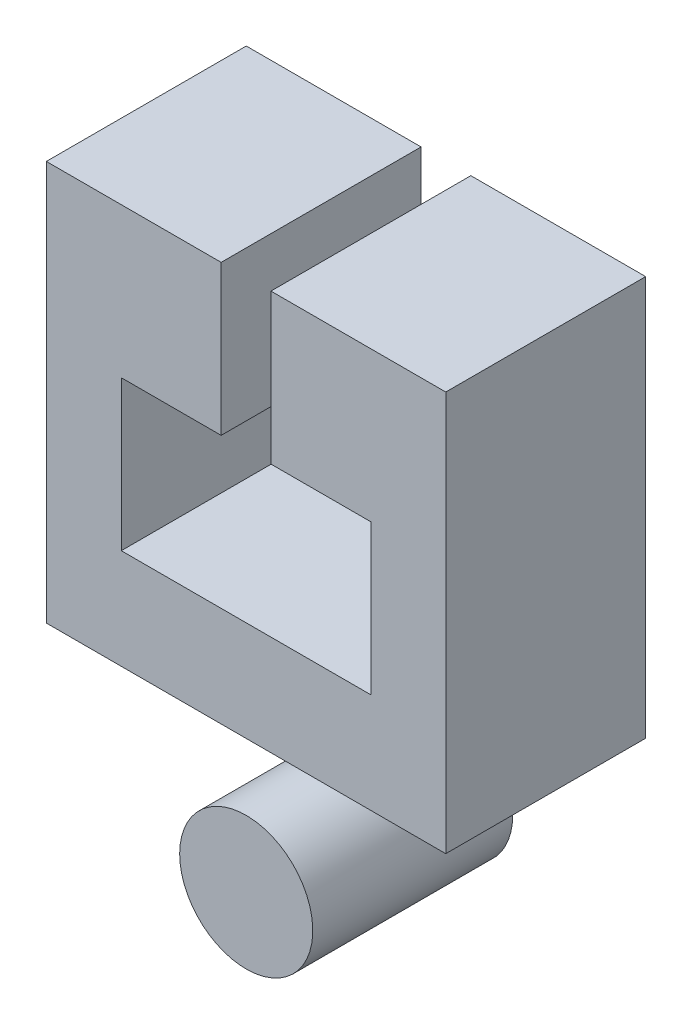
ISO-10303-21;
HEADER;
FILE_DESCRIPTION(('STEP AP214'),'2;1');
FILE_NAME('part.step','',(''),(''),'','','');
FILE_SCHEMA(('AUTOMOTIVE_DESIGN { 1 0 10303 214 1 1 1 1 }'));
ENDSEC;
DATA;
#1=APPLICATION_CONTEXT('core data for automotive mechanical design processes');
#2=APPLICATION_PROTOCOL_DEFINITION('international standard','automotive_design',2000,#1);
#3=PRODUCT_CONTEXT('',#1,'mechanical');
#4=PRODUCT('Part','Part','',(#3));
#5=PRODUCT_RELATED_PRODUCT_CATEGORY('part','',(#4));
#6=PRODUCT_DEFINITION_FORMATION('','',#4);
#7=PRODUCT_DEFINITION_CONTEXT('part definition',#1,'design');
#8=PRODUCT_DEFINITION('design','',#6,#7);
#9=PRODUCT_DEFINITION_SHAPE('','',#8);
#10=(LENGTH_UNIT() NAMED_UNIT(*) SI_UNIT(.MILLI.,.METRE.));
#11=(NAMED_UNIT(*) PLANE_ANGLE_UNIT() SI_UNIT($,.RADIAN.));
#12=(NAMED_UNIT(*) SI_UNIT($,.STERADIAN.) SOLID_ANGLE_UNIT());
#13=UNCERTAINTY_MEASURE_WITH_UNIT(LENGTH_MEASURE(1.E-05),#10,'distance_accuracy_value','');
#14=(GEOMETRIC_REPRESENTATION_CONTEXT(3) GLOBAL_UNCERTAINTY_ASSIGNED_CONTEXT((#13)) GLOBAL_UNIT_ASSIGNED_CONTEXT((#10,
#11,#12)) REPRESENTATION_CONTEXT('',''));
#15=CARTESIAN_POINT('',(0.,0.,0.));
#16=DIRECTION('',(0.,0.,1.));
#17=DIRECTION('',(1.,0.,0.));
#18=AXIS2_PLACEMENT_3D('',#15,#16,#17);
#19=CARTESIAN_POINT('',(0.,101.6,-50.8));
#20=DIRECTION('',(0.,-1.,0.));
#21=DIRECTION('',(0.,0.,-1.));
#22=AXIS2_PLACEMENT_3D('',#19,#20,#21);
#23=PLANE('',#22);
#24=DIRECTION('',(0.,0.,1.));
#25=VECTOR('',#24,1.);
#26=CARTESIAN_POINT('',(-6.32460000000001,101.6,-50.8));
#27=LINE('',#26,#25);
#28=CARTESIAN_POINT('',(-6.32460000000001,101.6,-50.8));
#29=VERTEX_POINT('',#28);
#30=CARTESIAN_POINT('',(-6.32460000000001,101.6,0.));
#31=VERTEX_POINT('',#30);
#32=EDGE_CURVE('E206',#29,#31,#27,.T.);
#33=ORIENTED_EDGE('',*,*,#32,.F.);
#34=DIRECTION('',(1.,0.,0.));
#35=VECTOR('',#34,1.);
#36=CARTESIAN_POINT('',(0.,101.6,-50.8));
#37=LINE('',#36,#35);
#38=CARTESIAN_POINT('',(-50.7492,101.6,-50.8));
#39=VERTEX_POINT('',#38);
#40=EDGE_CURVE('E242',#39,#29,#37,.T.);
#41=ORIENTED_EDGE('',*,*,#40,.F.);
#42=DIRECTION('',(0.,0.,1.));
#43=VECTOR('',#42,1.);
#44=CARTESIAN_POINT('',(-50.7492,101.6,-50.8));
#45=LINE('',#44,#43);
#46=CARTESIAN_POINT('',(-50.7492,101.6,0.));
#47=VERTEX_POINT('',#46);
#48=EDGE_CURVE('E256',#39,#47,#45,.T.);
#49=ORIENTED_EDGE('',*,*,#48,.T.);
#50=DIRECTION('',(1.,0.,0.));
#51=VECTOR('',#50,1.);
#52=CARTESIAN_POINT('',(0.,101.6,0.));
#53=LINE('',#52,#51);
#54=EDGE_CURVE('E260',#47,#31,#53,.T.);
#55=ORIENTED_EDGE('',*,*,#54,.T.);
#56=EDGE_LOOP('',(#33,#41,#49,#55));
#57=FACE_BOUND('',#56,.T.);
#58=ADVANCED_FACE('F41',(#57),#23,.F.);
#59=CARTESIAN_POINT('',(0.,0.,-50.8));
#60=DIRECTION('',(0.,0.,1.));
#61=DIRECTION('',(1.,0.,0.));
#62=AXIS2_PLACEMENT_3D('',#59,#60,#61);
#63=PLANE('',#62);
#64=DIRECTION('',(0.,-1.,0.));
#65=VECTOR('',#64,1.);
#66=CARTESIAN_POINT('',(16.9598350312076,0.,-50.8));
#67=LINE('',#66,#65);
#68=CARTESIAN_POINT('',(16.9598350312076,0.,-50.8));
#69=VERTEX_POINT('',#68);
#70=CARTESIAN_POINT('',(16.9598350312076,-33.8328,-50.8));
#71=VERTEX_POINT('',#70);
#72=EDGE_CURVE('E57',#69,#71,#67,.T.);
#73=ORIENTED_EDGE('',*,*,#72,.T.);
#74=CARTESIAN_POINT('',(0.0434350312076039,-33.8328,-50.8));
#75=DIRECTION('',(0.,0.,-1.));
#76=DIRECTION('',(-1.,0.,0.));
#77=AXIS2_PLACEMENT_3D('',#74,#75,#76);
#78=CIRCLE('',#77,16.9164);
#79=CARTESIAN_POINT('',(-16.8729649687924,-33.8328,-50.8));
#80=VERTEX_POINT('',#79);
#81=EDGE_CURVE('E158',#71,#80,#78,.T.);
#82=ORIENTED_EDGE('',*,*,#81,.T.);
#83=DIRECTION('',(0.,1.,0.));
#84=VECTOR('',#83,1.);
#85=CARTESIAN_POINT('',(-16.8729649687924,0.,-50.8));
#86=LINE('',#85,#84);
#87=CARTESIAN_POINT('',(-16.8729649687924,0.,-50.8));
#88=VERTEX_POINT('',#87);
#89=EDGE_CURVE('E167',#80,#88,#86,.T.);
#90=ORIENTED_EDGE('',*,*,#89,.T.);
#91=DIRECTION('',(1.,0.,0.));
#92=VECTOR('',#91,1.);
#93=CARTESIAN_POINT('',(0.,0.,-50.8));
#94=LINE('',#93,#92);
#95=CARTESIAN_POINT('',(-50.7492,0.,-50.8));
#96=VERTEX_POINT('',#95);
#97=EDGE_CURVE('E252',#96,#88,#94,.T.);
#98=ORIENTED_EDGE('',*,*,#97,.F.);
#99=DIRECTION('',(0.,1.,0.));
#100=VECTOR('',#99,1.);
#101=CARTESIAN_POINT('',(-50.7492,0.,-50.8));
#102=LINE('',#101,#100);
#103=EDGE_CURVE('E250',#96,#39,#102,.T.);
#104=ORIENTED_EDGE('',*,*,#103,.T.);
#105=ORIENTED_EDGE('',*,*,#40,.T.);
#106=DIRECTION('',(0.,-1.,0.));
#107=VECTOR('',#106,1.);
#108=CARTESIAN_POINT('',(-6.32460000000001,101.6,-50.8));
#109=LINE('',#108,#107);
#110=CARTESIAN_POINT('',(-6.3246,63.5254,-50.8));
#111=VERTEX_POINT('',#110);
#112=EDGE_CURVE('E201',#29,#111,#109,.T.);
#113=ORIENTED_EDGE('',*,*,#112,.T.);
#114=DIRECTION('',(-1.,0.,0.));
#115=VECTOR('',#114,1.);
#116=CARTESIAN_POINT('',(-6.3246,63.5254,-50.8));
#117=LINE('',#116,#115);
#118=CARTESIAN_POINT('',(-31.70428,63.5254,-50.8));
#119=VERTEX_POINT('',#118);
#120=EDGE_CURVE('E205',#111,#119,#117,.T.);
#121=ORIENTED_EDGE('',*,*,#120,.T.);
#122=DIRECTION('',(0.,-1.,0.));
#123=VECTOR('',#122,1.);
#124=CARTESIAN_POINT('',(-31.70428,63.5254,-50.8));
#125=LINE('',#124,#123);
#126=CARTESIAN_POINT('',(-31.70428,25.4508,-50.8));
#127=VERTEX_POINT('',#126);
#128=EDGE_CURVE('E200',#119,#127,#125,.T.);
#129=ORIENTED_EDGE('',*,*,#128,.T.);
#130=DIRECTION('',(-1.,0.,0.));
#131=VECTOR('',#130,1.);
#132=CARTESIAN_POINT('',(31.70428,25.4508,-50.8));
#133=LINE('',#132,#131);
#134=CARTESIAN_POINT('',(31.70428,25.4508,-50.8));
#135=VERTEX_POINT('',#134);
#136=EDGE_CURVE('E199',#135,#127,#133,.T.);
#137=ORIENTED_EDGE('',*,*,#136,.F.);
#138=DIRECTION('',(0.,-1.,0.));
#139=VECTOR('',#138,1.);
#140=CARTESIAN_POINT('',(31.70428,63.5254,-50.8));
#141=LINE('',#140,#139);
#142=CARTESIAN_POINT('',(31.70428,63.5254,-50.8));
#143=VERTEX_POINT('',#142);
#144=EDGE_CURVE('E194',#143,#135,#141,.T.);
#145=ORIENTED_EDGE('',*,*,#144,.F.);
#146=DIRECTION('',(1.,0.,0.));
#147=VECTOR('',#146,1.);
#148=CARTESIAN_POINT('',(6.3246,63.5254,-50.8));
#149=LINE('',#148,#147);
#150=CARTESIAN_POINT('',(6.3246,63.5254,-50.8));
#151=VERTEX_POINT('',#150);
#152=EDGE_CURVE('E192',#151,#143,#149,.T.);
#153=ORIENTED_EDGE('',*,*,#152,.F.);
#154=DIRECTION('',(0.,-1.,0.));
#155=VECTOR('',#154,1.);
#156=CARTESIAN_POINT('',(6.3246,101.6,-50.8));
#157=LINE('',#156,#155);
#158=CARTESIAN_POINT('',(6.3246,101.6,-50.8));
#159=VERTEX_POINT('',#158);
#160=EDGE_CURVE('E191',#159,#151,#157,.T.);
#161=ORIENTED_EDGE('',*,*,#160,.F.);
#162=CARTESIAN_POINT('',(50.7492,101.6,-50.8));
#163=VERTEX_POINT('',#162);
#164=EDGE_CURVE('E247',#159,#163,#37,.T.);
#165=ORIENTED_EDGE('',*,*,#164,.T.);
#166=DIRECTION('',(0.,1.,0.));
#167=VECTOR('',#166,1.);
#168=CARTESIAN_POINT('',(50.7492,0.,-50.8));
#169=LINE('',#168,#167);
#170=CARTESIAN_POINT('',(50.7492,0.,-50.8));
#171=VERTEX_POINT('',#170);
#172=EDGE_CURVE('E254',#171,#163,#169,.T.);
#173=ORIENTED_EDGE('',*,*,#172,.F.);
#174=EDGE_CURVE('E249',#69,#171,#94,.T.);
#175=ORIENTED_EDGE('',*,*,#174,.F.);
#176=EDGE_LOOP('',(#73,#82,#90,#98,#104,#105,#113,#121,#129,#137,#145,#153,#161,#165,#173,#175));
#177=FACE_BOUND('',#176,.T.);
#178=ADVANCED_FACE('F166',(#177),#63,.F.);
#179=ORIENTED_EDGE('',*,*,#164,.F.);
#180=DIRECTION('',(0.,0.,1.));
#181=VECTOR('',#180,1.);
#182=CARTESIAN_POINT('',(6.3246,101.6,-50.8));
#183=LINE('',#182,#181);
#184=CARTESIAN_POINT('',(6.3246,101.6,0.));
#185=VERTEX_POINT('',#184);
#186=EDGE_CURVE('E239',#159,#185,#183,.T.);
#187=ORIENTED_EDGE('',*,*,#186,.T.);
#188=CARTESIAN_POINT('',(50.7492,101.6,0.));
#189=VERTEX_POINT('',#188);
#190=EDGE_CURVE('E243',#185,#189,#53,.T.);
#191=ORIENTED_EDGE('',*,*,#190,.T.);
#192=DIRECTION('',(0.,0.,1.));
#193=VECTOR('',#192,1.);
#194=CARTESIAN_POINT('',(50.7492,101.6,-50.8));
#195=LINE('',#194,#193);
#196=EDGE_CURVE('E47',#163,#189,#195,.T.);
#197=ORIENTED_EDGE('',*,*,#196,.F.);
#198=EDGE_LOOP('',(#179,#187,#191,#197));
#199=FACE_BOUND('',#198,.T.);
#200=ADVANCED_FACE('F43',(#199),#23,.F.);
#201=CARTESIAN_POINT('',(50.7492,0.,-50.8));
#202=DIRECTION('',(1.,0.,0.));
#203=DIRECTION('',(0.,0.,-1.));
#204=AXIS2_PLACEMENT_3D('',#201,#202,#203);
#205=PLANE('',#204);
#206=DIRECTION('',(0.,1.,0.));
#207=VECTOR('',#206,1.);
#208=CARTESIAN_POINT('',(50.7492,0.,0.));
#209=LINE('',#208,#207);
#210=CARTESIAN_POINT('',(50.7492,0.,0.));
#211=VERTEX_POINT('',#210);
#212=EDGE_CURVE('E261',#211,#189,#209,.T.);
#213=ORIENTED_EDGE('',*,*,#212,.F.);
#214=DIRECTION('',(0.,0.,1.));
#215=VECTOR('',#214,1.);
#216=CARTESIAN_POINT('',(50.7492,0.,-50.8));
#217=LINE('',#216,#215);
#218=EDGE_CURVE('E266',#171,#211,#217,.T.);
#219=ORIENTED_EDGE('',*,*,#218,.F.);
#220=ORIENTED_EDGE('',*,*,#172,.T.);
#221=ORIENTED_EDGE('',*,*,#196,.T.);
#222=EDGE_LOOP('',(#213,#219,#220,#221));
#223=FACE_BOUND('',#222,.T.);
#224=ADVANCED_FACE('F299',(#223),#205,.T.);
#225=CARTESIAN_POINT('',(0.,0.,-50.8));
#226=DIRECTION('',(0.,-1.,0.));
#227=DIRECTION('',(0.,0.,-1.));
#228=AXIS2_PLACEMENT_3D('',#225,#226,#227);
#229=PLANE('',#228);
#230=DIRECTION('',(0.,0.,-1.));
#231=VECTOR('',#230,1.);
#232=CARTESIAN_POINT('',(-16.8729649687924,0.,-50.2412));
#233=LINE('',#232,#231);
#234=CARTESIAN_POINT('',(-16.8729649687924,0.,-50.2412));
#235=VERTEX_POINT('',#234);
#236=EDGE_CURVE('E180',#235,#88,#233,.T.);
#237=ORIENTED_EDGE('',*,*,#236,.F.);
#238=DIRECTION('',(1.,0.,0.));
#239=VECTOR('',#238,1.);
#240=CARTESIAN_POINT('',(-16.8729649687924,0.,-50.2412));
#241=LINE('',#240,#239);
#242=CARTESIAN_POINT('',(16.9598350312076,0.,-50.2412));
#243=VERTEX_POINT('',#242);
#244=EDGE_CURVE('E328',#235,#243,#241,.T.);
#245=ORIENTED_EDGE('',*,*,#244,.T.);
#246=DIRECTION('',(0.,0.,-1.));
#247=VECTOR('',#246,1.);
#248=CARTESIAN_POINT('',(16.9598350312076,0.,-50.2412));
#249=LINE('',#248,#247);
#250=EDGE_CURVE('E189',#243,#69,#249,.T.);
#251=ORIENTED_EDGE('',*,*,#250,.T.);
#252=ORIENTED_EDGE('',*,*,#174,.T.);
#253=ORIENTED_EDGE('',*,*,#218,.T.);
#254=DIRECTION('',(1.,0.,0.));
#255=VECTOR('',#254,1.);
#256=CARTESIAN_POINT('',(0.,0.,0.));
#257=LINE('',#256,#255);
#258=CARTESIAN_POINT('',(-50.7492,0.,0.));
#259=VERTEX_POINT('',#258);
#260=EDGE_CURVE('E264',#259,#211,#257,.T.);
#261=ORIENTED_EDGE('',*,*,#260,.F.);
#262=DIRECTION('',(0.,0.,1.));
#263=VECTOR('',#262,1.);
#264=CARTESIAN_POINT('',(-50.7492,0.,-50.8));
#265=LINE('',#264,#263);
#266=EDGE_CURVE('E275',#96,#259,#265,.T.);
#267=ORIENTED_EDGE('',*,*,#266,.F.);
#268=ORIENTED_EDGE('',*,*,#97,.T.);
#269=EDGE_LOOP('',(#237,#245,#251,#252,#253,#261,#267,#268));
#270=FACE_BOUND('',#269,.T.);
#271=ADVANCED_FACE('F295',(#270),#229,.T.);
#272=CARTESIAN_POINT('',(-50.7492,0.,-50.8));
#273=DIRECTION('',(1.,0.,0.));
#274=DIRECTION('',(0.,0.,-1.));
#275=AXIS2_PLACEMENT_3D('',#272,#273,#274);
#276=PLANE('',#275);
#277=DIRECTION('',(0.,1.,0.));
#278=VECTOR('',#277,1.);
#279=CARTESIAN_POINT('',(-50.7492,0.,0.));
#280=LINE('',#279,#278);
#281=EDGE_CURVE('E259',#259,#47,#280,.T.);
#282=ORIENTED_EDGE('',*,*,#281,.T.);
#283=ORIENTED_EDGE('',*,*,#48,.F.);
#284=ORIENTED_EDGE('',*,*,#103,.F.);
#285=ORIENTED_EDGE('',*,*,#266,.T.);
#286=EDGE_LOOP('',(#282,#283,#284,#285));
#287=FACE_BOUND('',#286,.T.);
#288=ADVANCED_FACE('F292',(#287),#276,.F.);
#289=CARTESIAN_POINT('',(0.,0.,0.));
#290=DIRECTION('',(0.,0.,1.));
#291=DIRECTION('',(1.,0.,0.));
#292=AXIS2_PLACEMENT_3D('',#289,#290,#291);
#293=PLANE('',#292);
#294=DIRECTION('',(0.,-1.,0.));
#295=VECTOR('',#294,1.);
#296=CARTESIAN_POINT('',(-6.32460000000001,101.6,0.));
#297=LINE('',#296,#295);
#298=CARTESIAN_POINT('',(-6.3246,63.5254,0.));
#299=VERTEX_POINT('',#298);
#300=EDGE_CURVE('E63',#31,#299,#297,.T.);
#301=ORIENTED_EDGE('',*,*,#300,.F.);
#302=ORIENTED_EDGE('',*,*,#54,.F.);
#303=ORIENTED_EDGE('',*,*,#281,.F.);
#304=ORIENTED_EDGE('',*,*,#260,.T.);
#305=ORIENTED_EDGE('',*,*,#212,.T.);
#306=ORIENTED_EDGE('',*,*,#190,.F.);
#307=DIRECTION('',(0.,-1.,0.));
#308=VECTOR('',#307,1.);
#309=CARTESIAN_POINT('',(6.3246,101.6,0.));
#310=LINE('',#309,#308);
#311=CARTESIAN_POINT('',(6.3246,63.5254,0.));
#312=VERTEX_POINT('',#311);
#313=EDGE_CURVE('E161',#185,#312,#310,.T.);
#314=ORIENTED_EDGE('',*,*,#313,.T.);
#315=DIRECTION('',(1.,0.,0.));
#316=VECTOR('',#315,1.);
#317=CARTESIAN_POINT('',(6.3246,63.5254,0.));
#318=LINE('',#317,#316);
#319=CARTESIAN_POINT('',(31.70428,63.5254,0.));
#320=VERTEX_POINT('',#319);
#321=EDGE_CURVE('E211',#312,#320,#318,.T.);
#322=ORIENTED_EDGE('',*,*,#321,.T.);
#323=DIRECTION('',(0.,-1.,0.));
#324=VECTOR('',#323,1.);
#325=CARTESIAN_POINT('',(31.70428,63.5254,0.));
#326=LINE('',#325,#324);
#327=CARTESIAN_POINT('',(31.70428,25.4508,0.));
#328=VERTEX_POINT('',#327);
#329=EDGE_CURVE('E213',#320,#328,#326,.T.);
#330=ORIENTED_EDGE('',*,*,#329,.T.);
#331=DIRECTION('',(-1.,0.,0.));
#332=VECTOR('',#331,1.);
#333=CARTESIAN_POINT('',(31.70428,25.4508,0.));
#334=LINE('',#333,#332);
#335=CARTESIAN_POINT('',(-31.70428,25.4508,0.));
#336=VERTEX_POINT('',#335);
#337=EDGE_CURVE('E219',#328,#336,#334,.T.);
#338=ORIENTED_EDGE('',*,*,#337,.T.);
#339=DIRECTION('',(0.,-1.,0.));
#340=VECTOR('',#339,1.);
#341=CARTESIAN_POINT('',(-31.70428,63.5254,0.));
#342=LINE('',#341,#340);
#343=CARTESIAN_POINT('',(-31.70428,63.5254,0.));
#344=VERTEX_POINT('',#343);
#345=EDGE_CURVE('E216',#344,#336,#342,.T.);
#346=ORIENTED_EDGE('',*,*,#345,.F.);
#347=DIRECTION('',(-1.,0.,0.));
#348=VECTOR('',#347,1.);
#349=CARTESIAN_POINT('',(-6.3246,63.5254,0.));
#350=LINE('',#349,#348);
#351=EDGE_CURVE('E223',#299,#344,#350,.T.);
#352=ORIENTED_EDGE('',*,*,#351,.F.);
#353=EDGE_LOOP('',(#301,#302,#303,#304,#305,#306,#314,#322,#330,#338,#346,#352));
#354=FACE_BOUND('',#353,.T.);
#355=ADVANCED_FACE('F282',(#354),#293,.T.);
#356=CARTESIAN_POINT('',(6.3246,101.6,-50.8));
#357=DIRECTION('',(-1.,0.,0.));
#358=DIRECTION('',(0.,-1.,0.));
#359=AXIS2_PLACEMENT_3D('',#356,#357,#358);
#360=PLANE('',#359);
#361=ORIENTED_EDGE('',*,*,#313,.F.);
#362=ORIENTED_EDGE('',*,*,#186,.F.);
#363=ORIENTED_EDGE('',*,*,#160,.T.);
#364=DIRECTION('',(0.,0.,1.));
#365=VECTOR('',#364,1.);
#366=CARTESIAN_POINT('',(6.3246,63.5254,-50.8));
#367=LINE('',#366,#365);
#368=EDGE_CURVE('E238',#151,#312,#367,.T.);
#369=ORIENTED_EDGE('',*,*,#368,.T.);
#370=EDGE_LOOP('',(#361,#362,#363,#369));
#371=FACE_BOUND('',#370,.T.);
#372=ADVANCED_FACE('F306',(#371),#360,.T.);
#373=CARTESIAN_POINT('',(6.3246,63.5254,-50.8));
#374=DIRECTION('',(0.,-1.,0.));
#375=DIRECTION('',(0.,0.,-1.));
#376=AXIS2_PLACEMENT_3D('',#373,#374,#375);
#377=PLANE('',#376);
#378=ORIENTED_EDGE('',*,*,#321,.F.);
#379=ORIENTED_EDGE('',*,*,#368,.F.);
#380=ORIENTED_EDGE('',*,*,#152,.T.);
#381=DIRECTION('',(0.,0.,1.));
#382=VECTOR('',#381,1.);
#383=CARTESIAN_POINT('',(31.70428,63.5254,-50.8));
#384=LINE('',#383,#382);
#385=EDGE_CURVE('E236',#143,#320,#384,.T.);
#386=ORIENTED_EDGE('',*,*,#385,.T.);
#387=EDGE_LOOP('',(#378,#379,#380,#386));
#388=FACE_BOUND('',#387,.T.);
#389=ADVANCED_FACE('F311',(#388),#377,.T.);
#390=CARTESIAN_POINT('',(31.70428,63.5254,-50.8));
#391=DIRECTION('',(-1.,0.,0.));
#392=DIRECTION('',(0.,-1.,0.));
#393=AXIS2_PLACEMENT_3D('',#390,#391,#392);
#394=PLANE('',#393);
#395=ORIENTED_EDGE('',*,*,#329,.F.);
#396=ORIENTED_EDGE('',*,*,#385,.F.);
#397=ORIENTED_EDGE('',*,*,#144,.T.);
#398=DIRECTION('',(0.,0.,1.));
#399=VECTOR('',#398,1.);
#400=CARTESIAN_POINT('',(31.70428,25.4508,-50.8));
#401=LINE('',#400,#399);
#402=EDGE_CURVE('E234',#135,#328,#401,.T.);
#403=ORIENTED_EDGE('',*,*,#402,.T.);
#404=EDGE_LOOP('',(#395,#396,#397,#403));
#405=FACE_BOUND('',#404,.T.);
#406=ADVANCED_FACE('F317',(#405),#394,.T.);
#407=CARTESIAN_POINT('',(31.70428,25.4508,-50.8));
#408=DIRECTION('',(0.,1.,0.));
#409=DIRECTION('',(-1.,0.,0.));
#410=AXIS2_PLACEMENT_3D('',#407,#408,#409);
#411=PLANE('',#410);
#412=ORIENTED_EDGE('',*,*,#337,.F.);
#413=ORIENTED_EDGE('',*,*,#402,.F.);
#414=ORIENTED_EDGE('',*,*,#136,.T.);
#415=DIRECTION('',(0.,0.,1.));
#416=VECTOR('',#415,1.);
#417=CARTESIAN_POINT('',(-31.70428,25.4508,-50.8));
#418=LINE('',#417,#416);
#419=EDGE_CURVE('E235',#127,#336,#418,.T.);
#420=ORIENTED_EDGE('',*,*,#419,.T.);
#421=EDGE_LOOP('',(#412,#413,#414,#420));
#422=FACE_BOUND('',#421,.T.);
#423=ADVANCED_FACE('F318',(#422),#411,.T.);
#424=CARTESIAN_POINT('',(-31.70428,63.5254,-50.8));
#425=DIRECTION('',(-1.,0.,0.));
#426=DIRECTION('',(0.,-1.,0.));
#427=AXIS2_PLACEMENT_3D('',#424,#425,#426);
#428=PLANE('',#427);
#429=ORIENTED_EDGE('',*,*,#345,.T.);
#430=ORIENTED_EDGE('',*,*,#419,.F.);
#431=ORIENTED_EDGE('',*,*,#128,.F.);
#432=DIRECTION('',(0.,0.,1.));
#433=VECTOR('',#432,1.);
#434=CARTESIAN_POINT('',(-31.70428,63.5254,-50.8));
#435=LINE('',#434,#433);
#436=EDGE_CURVE('E229',#119,#344,#435,.T.);
#437=ORIENTED_EDGE('',*,*,#436,.T.);
#438=EDGE_LOOP('',(#429,#430,#431,#437));
#439=FACE_BOUND('',#438,.T.);
#440=ADVANCED_FACE('F323',(#439),#428,.F.);
#441=CARTESIAN_POINT('',(-6.3246,63.5254,-50.8));
#442=DIRECTION('',(0.,1.,0.));
#443=DIRECTION('',(-1.,0.,0.));
#444=AXIS2_PLACEMENT_3D('',#441,#442,#443);
#445=PLANE('',#444);
#446=ORIENTED_EDGE('',*,*,#351,.T.);
#447=ORIENTED_EDGE('',*,*,#436,.F.);
#448=ORIENTED_EDGE('',*,*,#120,.F.);
#449=DIRECTION('',(0.,0.,1.));
#450=VECTOR('',#449,1.);
#451=CARTESIAN_POINT('',(-6.3246,63.5254,-50.8));
#452=LINE('',#451,#450);
#453=EDGE_CURVE('E226',#111,#299,#452,.T.);
#454=ORIENTED_EDGE('',*,*,#453,.T.);
#455=EDGE_LOOP('',(#446,#447,#448,#454));
#456=FACE_BOUND('',#455,.T.);
#457=ADVANCED_FACE('F288',(#456),#445,.F.);
#458=CARTESIAN_POINT('',(-6.32460000000001,101.6,-50.8));
#459=DIRECTION('',(-1.,0.,0.));
#460=DIRECTION('',(0.,-1.,0.));
#461=AXIS2_PLACEMENT_3D('',#458,#459,#460);
#462=PLANE('',#461);
#463=ORIENTED_EDGE('',*,*,#300,.T.);
#464=ORIENTED_EDGE('',*,*,#453,.F.);
#465=ORIENTED_EDGE('',*,*,#112,.F.);
#466=ORIENTED_EDGE('',*,*,#32,.T.);
#467=EDGE_LOOP('',(#463,#464,#465,#466));
#468=FACE_BOUND('',#467,.T.);
#469=ADVANCED_FACE('F293',(#468),#462,.F.);
#470=CARTESIAN_POINT('',(-16.8729649687924,0.,-50.2412));
#471=DIRECTION('',(-1.,0.,0.));
#472=DIRECTION('',(0.,-1.,0.));
#473=AXIS2_PLACEMENT_3D('',#470,#471,#472);
#474=PLANE('',#473);
#475=ORIENTED_EDGE('',*,*,#89,.F.);
#476=DIRECTION('',(0.,0.,-1.));
#477=VECTOR('',#476,1.);
#478=CARTESIAN_POINT('',(-16.8729649687924,-33.8328,-50.2412));
#479=LINE('',#478,#477);
#480=CARTESIAN_POINT('',(-16.8729649687924,-33.8328,-50.2412));
#481=VERTEX_POINT('',#480);
#482=EDGE_CURVE('E155',#481,#80,#479,.T.);
#483=ORIENTED_EDGE('',*,*,#482,.F.);
#484=DIRECTION('',(0.,1.,0.));
#485=VECTOR('',#484,1.);
#486=CARTESIAN_POINT('',(-16.8729649687924,0.,-50.2412));
#487=LINE('',#486,#485);
#488=EDGE_CURVE('E177',#481,#235,#487,.T.);
#489=ORIENTED_EDGE('',*,*,#488,.T.);
#490=ORIENTED_EDGE('',*,*,#236,.T.);
#491=EDGE_LOOP('',(#475,#483,#489,#490));
#492=FACE_BOUND('',#491,.T.);
#493=ADVANCED_FACE('F174',(#492),#474,.T.);
#494=CARTESIAN_POINT('',(16.9598350312076,0.,-50.2412));
#495=DIRECTION('',(1.,0.,0.));
#496=DIRECTION('',(0.,1.,0.));
#497=AXIS2_PLACEMENT_3D('',#494,#495,#496);
#498=PLANE('',#497);
#499=ORIENTED_EDGE('',*,*,#72,.F.);
#500=ORIENTED_EDGE('',*,*,#250,.F.);
#501=DIRECTION('',(0.,-1.,0.));
#502=VECTOR('',#501,1.);
#503=CARTESIAN_POINT('',(16.9598350312076,0.,-50.2412));
#504=LINE('',#503,#502);
#505=CARTESIAN_POINT('',(16.9598350312076,-33.8328,-50.2412));
#506=VERTEX_POINT('',#505);
#507=EDGE_CURVE('E183',#243,#506,#504,.T.);
#508=ORIENTED_EDGE('',*,*,#507,.T.);
#509=DIRECTION('',(0.,0.,-1.));
#510=VECTOR('',#509,1.);
#511=CARTESIAN_POINT('',(16.9598350312076,-33.8328,-50.2412));
#512=LINE('',#511,#510);
#513=EDGE_CURVE('E165',#506,#71,#512,.T.);
#514=ORIENTED_EDGE('',*,*,#513,.T.);
#515=EDGE_LOOP('',(#499,#500,#508,#514));
#516=FACE_BOUND('',#515,.T.);
#517=ADVANCED_FACE('F330',(#516),#498,.T.);
#518=CARTESIAN_POINT('',(0.,0.,-50.2412));
#519=DIRECTION('',(0.,0.,-1.));
#520=DIRECTION('',(-1.,0.,0.));
#521=AXIS2_PLACEMENT_3D('',#518,#519,#520);
#522=PLANE('',#521);
#523=ORIENTED_EDGE('',*,*,#488,.F.);
#524=CARTESIAN_POINT('',(0.0434350312076039,-33.8328,-50.2412));
#525=DIRECTION('',(0.,0.,-1.));
#526=DIRECTION('',(-1.,0.,0.));
#527=AXIS2_PLACEMENT_3D('',#524,#525,#526);
#528=CIRCLE('',#527,16.9164);
#529=EDGE_CURVE('E11',#481,#506,#528,.T.);
#530=ORIENTED_EDGE('',*,*,#529,.T.);
#531=ORIENTED_EDGE('',*,*,#507,.F.);
#532=ORIENTED_EDGE('',*,*,#244,.F.);
#533=EDGE_LOOP('',(#523,#530,#531,#532));
#534=FACE_BOUND('',#533,.T.);
#535=ADVANCED_FACE('F332',(#534),#522,.F.);
#536=CARTESIAN_POINT('',(0.0434350312076039,-33.8328,0.));
#537=DIRECTION('',(0.,0.,-1.));
#538=DIRECTION('',(-1.,0.,0.));
#539=AXIS2_PLACEMENT_3D('',#536,#537,#538);
#540=CYLINDRICAL_SURFACE('',#539,16.9164);
#541=ORIENTED_EDGE('',*,*,#529,.F.);
#542=ORIENTED_EDGE('',*,*,#482,.T.);
#543=ORIENTED_EDGE('',*,*,#81,.F.);
#544=ORIENTED_EDGE('',*,*,#513,.F.);
#545=EDGE_LOOP('',(#541,#542,#543,#544));
#546=FACE_BOUND('',#545,.T.);
#547=CARTESIAN_POINT('',(0.0434350312076039,-33.8328,0.));
#548=DIRECTION('',(0.,0.,-1.));
#549=DIRECTION('',(-1.,0.,0.));
#550=AXIS2_PLACEMENT_3D('',#547,#548,#549);
#551=CIRCLE('',#550,16.9164);
#552=CARTESIAN_POINT('',(-16.8729649687924,-33.8328,0.));
#553=VERTEX_POINT('',#552);
#554=EDGE_CURVE('E173',#553,#553,#551,.T.);
#555=ORIENTED_EDGE('',*,*,#554,.T.);
#556=EDGE_LOOP('',(#555));
#557=FACE_BOUND('',#556,.T.);
#558=ADVANCED_FACE('F157',(#546,#557),#540,.T.);
#559=CARTESIAN_POINT('',(0.0434350312076039,-33.8328,0.));
#560=DIRECTION('',(0.,0.,-1.));
#561=DIRECTION('',(-1.,0.,0.));
#562=AXIS2_PLACEMENT_3D('',#559,#560,#561);
#563=PLANE('',#562);
#564=ORIENTED_EDGE('',*,*,#554,.F.);
#565=EDGE_LOOP('',(#564));
#566=FACE_BOUND('',#565,.T.);
#567=ADVANCED_FACE('F339',(#566),#563,.F.);
#568=CLOSED_SHELL('',(#58,#178,#200,#224,#271,#288,#355,#372,#389,#406,#423,#440,#457,#469,#493,
#517,#535,#558,#567));
#569=MANIFOLD_SOLID_BREP('B2',#568);
#570=ADVANCED_BREP_SHAPE_REPRESENTATION('',(#18,#569),#14);
#571=SHAPE_DEFINITION_REPRESENTATION(#9,#570);
ENDSEC;
END-ISO-10303-21;
